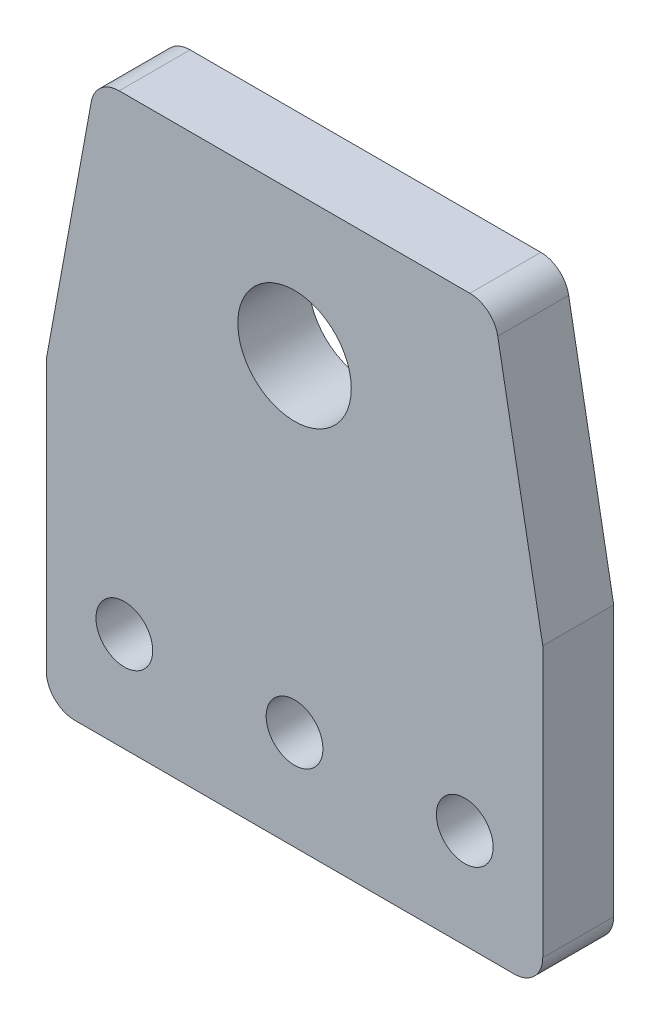
ISO-10303-21;
HEADER;
FILE_DESCRIPTION(('STEP AP214'),'2;1');
FILE_NAME('part.step','',(''),(''),'','','');
FILE_SCHEMA(('AUTOMOTIVE_DESIGN { 1 0 10303 214 1 1 1 1 }'));
ENDSEC;
DATA;
#1=APPLICATION_CONTEXT('core data for automotive mechanical design processes');
#2=APPLICATION_PROTOCOL_DEFINITION('international standard','automotive_design',2000,#1);
#3=PRODUCT_CONTEXT('',#1,'mechanical');
#4=PRODUCT('Part','Part','',(#3));
#5=PRODUCT_RELATED_PRODUCT_CATEGORY('part','',(#4));
#6=PRODUCT_DEFINITION_FORMATION('','',#4);
#7=PRODUCT_DEFINITION_CONTEXT('part definition',#1,'design');
#8=PRODUCT_DEFINITION('design','',#6,#7);
#9=PRODUCT_DEFINITION_SHAPE('','',#8);
#10=(LENGTH_UNIT() NAMED_UNIT(*) SI_UNIT(.MILLI.,.METRE.));
#11=(NAMED_UNIT(*) PLANE_ANGLE_UNIT() SI_UNIT($,.RADIAN.));
#12=(NAMED_UNIT(*) SI_UNIT($,.STERADIAN.) SOLID_ANGLE_UNIT());
#13=UNCERTAINTY_MEASURE_WITH_UNIT(LENGTH_MEASURE(1.E-05),#10,'distance_accuracy_value','');
#14=(GEOMETRIC_REPRESENTATION_CONTEXT(3) GLOBAL_UNCERTAINTY_ASSIGNED_CONTEXT((#13)) GLOBAL_UNIT_ASSIGNED_CONTEXT((#10,
#11,#12)) REPRESENTATION_CONTEXT('',''));
#15=CARTESIAN_POINT('',(0.,0.,0.));
#16=DIRECTION('',(0.,0.,1.));
#17=DIRECTION('',(1.,0.,0.));
#18=AXIS2_PLACEMENT_3D('',#15,#16,#17);
#19=CARTESIAN_POINT('',(33.,2.,5.));
#20=DIRECTION('',(0.,0.,1.));
#21=DIRECTION('',(1.,0.,0.));
#22=AXIS2_PLACEMENT_3D('',#19,#20,#21);
#23=PLANE('',#22);
#24=CARTESIAN_POINT('',(29.5,6.99999999999999,5.));
#25=DIRECTION('',(0.,0.,1.));
#26=DIRECTION('',(1.,0.,0.));
#27=AXIS2_PLACEMENT_3D('',#24,#25,#26);
#28=CIRCLE('',#27,2.00000000000001);
#29=CARTESIAN_POINT('',(31.5,6.99999999999999,5.));
#30=VERTEX_POINT('',#29);
#31=EDGE_CURVE('E221',#30,#30,#28,.T.);
#32=ORIENTED_EDGE('',*,*,#31,.F.);
#33=EDGE_LOOP('',(#32));
#34=FACE_BOUND('',#33,.T.);
#35=CARTESIAN_POINT('',(17.5,6.99999999999999,5.));
#36=DIRECTION('',(0.,0.,1.));
#37=DIRECTION('',(1.,0.,0.));
#38=AXIS2_PLACEMENT_3D('',#35,#36,#37);
#39=CIRCLE('',#38,2.);
#40=CARTESIAN_POINT('',(19.5,6.99999999999999,5.));
#41=VERTEX_POINT('',#40);
#42=EDGE_CURVE('E149',#41,#41,#39,.T.);
#43=ORIENTED_EDGE('',*,*,#42,.F.);
#44=EDGE_LOOP('',(#43));
#45=FACE_BOUND('',#44,.T.);
#46=CARTESIAN_POINT('',(33.,2.,5.));
#47=DIRECTION('',(0.,0.,1.));
#48=DIRECTION('',(1.,0.,0.));
#49=AXIS2_PLACEMENT_3D('',#46,#47,#48);
#50=CIRCLE('',#49,2.);
#51=CARTESIAN_POINT('',(33.,0.,5.));
#52=VERTEX_POINT('',#51);
#53=CARTESIAN_POINT('',(35.,2.,5.));
#54=VERTEX_POINT('',#53);
#55=EDGE_CURVE('E164',#52,#54,#50,.T.);
#56=ORIENTED_EDGE('',*,*,#55,.T.);
#57=DIRECTION('',(0.,1.,0.));
#58=VECTOR('',#57,1.);
#59=CARTESIAN_POINT('',(35.,2.,5.));
#60=LINE('',#59,#58);
#61=CARTESIAN_POINT('',(35.,21.0503418253546,5.));
#62=VERTEX_POINT('',#61);
#63=EDGE_CURVE('E102',#54,#62,#60,.T.);
#64=ORIENTED_EDGE('',*,*,#63,.T.);
#65=DIRECTION('',(-0.180238645749649,0.983622910763232,0.));
#66=VECTOR('',#65,1.);
#67=CARTESIAN_POINT('',(35.,21.0503418253546,5.));
#68=LINE('',#67,#66);
#69=CARTESIAN_POINT('',(31.828098105462,38.3604772914993,5.));
#70=VERTEX_POINT('',#69);
#71=EDGE_CURVE('E185',#62,#70,#68,.T.);
#72=ORIENTED_EDGE('',*,*,#71,.T.);
#73=CARTESIAN_POINT('',(29.8608522839355,38.,5.));
#74=DIRECTION('',(0.,0.,1.));
#75=DIRECTION('',(1.,0.,0.));
#76=AXIS2_PLACEMENT_3D('',#73,#74,#75);
#77=CIRCLE('',#76,1.99999999999999);
#78=CARTESIAN_POINT('',(29.8608522839355,40.,5.));
#79=VERTEX_POINT('',#78);
#80=EDGE_CURVE('E204',#70,#79,#77,.T.);
#81=ORIENTED_EDGE('',*,*,#80,.T.);
#82=DIRECTION('',(-1.,0.,0.));
#83=VECTOR('',#82,1.);
#84=CARTESIAN_POINT('',(29.8608522839355,40.,5.));
#85=LINE('',#84,#83);
#86=CARTESIAN_POINT('',(5.13914771606446,40.,5.));
#87=VERTEX_POINT('',#86);
#88=EDGE_CURVE('E201',#79,#87,#85,.T.);
#89=ORIENTED_EDGE('',*,*,#88,.T.);
#90=CARTESIAN_POINT('',(5.13914771606446,38.,5.));
#91=DIRECTION('',(0.,0.,1.));
#92=DIRECTION('',(1.,0.,0.));
#93=AXIS2_PLACEMENT_3D('',#90,#91,#92);
#94=CIRCLE('',#93,2.);
#95=CARTESIAN_POINT('',(3.171901894538,38.3604772914993,5.));
#96=VERTEX_POINT('',#95);
#97=EDGE_CURVE('E203',#87,#96,#94,.T.);
#98=ORIENTED_EDGE('',*,*,#97,.T.);
#99=DIRECTION('',(-0.180238645749649,-0.983622910763232,0.));
#100=VECTOR('',#99,1.);
#101=CARTESIAN_POINT('',(3.171901894538,38.3604772914993,5.));
#102=LINE('',#101,#100);
#103=CARTESIAN_POINT('',(0.,21.0503418253546,5.));
#104=VERTEX_POINT('',#103);
#105=EDGE_CURVE('E127',#96,#104,#102,.T.);
#106=ORIENTED_EDGE('',*,*,#105,.T.);
#107=DIRECTION('',(0.,-1.,0.));
#108=VECTOR('',#107,1.);
#109=CARTESIAN_POINT('',(0.,21.0503418253546,5.));
#110=LINE('',#109,#108);
#111=CARTESIAN_POINT('',(0.,2.,5.));
#112=VERTEX_POINT('',#111);
#113=EDGE_CURVE('E121',#104,#112,#110,.T.);
#114=ORIENTED_EDGE('',*,*,#113,.T.);
#115=CARTESIAN_POINT('',(2.,2.,5.));
#116=DIRECTION('',(0.,0.,1.));
#117=DIRECTION('',(-1.,0.,0.));
#118=AXIS2_PLACEMENT_3D('',#115,#116,#117);
#119=CIRCLE('',#118,2.);
#120=CARTESIAN_POINT('',(2.00000000000001,0.,5.));
#121=VERTEX_POINT('',#120);
#122=EDGE_CURVE('E125',#112,#121,#119,.T.);
#123=ORIENTED_EDGE('',*,*,#122,.T.);
#124=DIRECTION('',(1.,0.,0.));
#125=VECTOR('',#124,1.);
#126=CARTESIAN_POINT('',(2.00000000000001,0.,5.));
#127=LINE('',#126,#125);
#128=EDGE_CURVE('E53',#121,#52,#127,.T.);
#129=ORIENTED_EDGE('',*,*,#128,.T.);
#130=EDGE_LOOP('',(#56,#64,#72,#81,#89,#98,#106,#114,#123,#129));
#131=FACE_BOUND('',#130,.T.);
#132=CARTESIAN_POINT('',(17.5,30.,5.));
#133=DIRECTION('',(0.,0.,1.));
#134=DIRECTION('',(1.,0.,0.));
#135=AXIS2_PLACEMENT_3D('',#132,#133,#134);
#136=CIRCLE('',#135,4.);
#137=CARTESIAN_POINT('',(21.5,30.,5.));
#138=VERTEX_POINT('',#137);
#139=EDGE_CURVE('E215',#138,#138,#136,.T.);
#140=ORIENTED_EDGE('',*,*,#139,.F.);
#141=EDGE_LOOP('',(#140));
#142=FACE_BOUND('',#141,.T.);
#143=CARTESIAN_POINT('',(5.5,6.99999999999999,5.));
#144=DIRECTION('',(0.,0.,1.));
#145=DIRECTION('',(1.,0.,0.));
#146=AXIS2_PLACEMENT_3D('',#143,#144,#145);
#147=CIRCLE('',#146,2.);
#148=CARTESIAN_POINT('',(7.5,6.99999999999999,5.));
#149=VERTEX_POINT('',#148);
#150=EDGE_CURVE('E227',#149,#149,#147,.T.);
#151=ORIENTED_EDGE('',*,*,#150,.F.);
#152=EDGE_LOOP('',(#151));
#153=FACE_BOUND('',#152,.T.);
#154=ADVANCED_FACE('F36',(#34,#45,#131,#142,#153),#23,.T.);
#155=CARTESIAN_POINT('',(33.,2.,0.));
#156=DIRECTION('',(0.,0.,1.));
#157=DIRECTION('',(1.,0.,0.));
#158=AXIS2_PLACEMENT_3D('',#155,#156,#157);
#159=PLANE('',#158);
#160=CARTESIAN_POINT('',(33.,2.,0.));
#161=DIRECTION('',(0.,0.,1.));
#162=DIRECTION('',(1.,0.,0.));
#163=AXIS2_PLACEMENT_3D('',#160,#161,#162);
#164=CIRCLE('',#163,2.);
#165=CARTESIAN_POINT('',(33.,0.,0.));
#166=VERTEX_POINT('',#165);
#167=CARTESIAN_POINT('',(35.,2.,0.));
#168=VERTEX_POINT('',#167);
#169=EDGE_CURVE('E145',#166,#168,#164,.T.);
#170=ORIENTED_EDGE('',*,*,#169,.F.);
#171=DIRECTION('',(1.,0.,0.));
#172=VECTOR('',#171,1.);
#173=CARTESIAN_POINT('',(2.00000000000001,0.,0.));
#174=LINE('',#173,#172);
#175=CARTESIAN_POINT('',(2.00000000000001,0.,0.));
#176=VERTEX_POINT('',#175);
#177=EDGE_CURVE('E94',#176,#166,#174,.T.);
#178=ORIENTED_EDGE('',*,*,#177,.F.);
#179=CARTESIAN_POINT('',(2.,2.,0.));
#180=DIRECTION('',(0.,0.,1.));
#181=DIRECTION('',(-1.,0.,0.));
#182=AXIS2_PLACEMENT_3D('',#179,#180,#181);
#183=CIRCLE('',#182,2.);
#184=CARTESIAN_POINT('',(0.,2.,0.));
#185=VERTEX_POINT('',#184);
#186=EDGE_CURVE('E88',#185,#176,#183,.T.);
#187=ORIENTED_EDGE('',*,*,#186,.F.);
#188=DIRECTION('',(0.,-1.,0.));
#189=VECTOR('',#188,1.);
#190=CARTESIAN_POINT('',(0.,21.0503418253546,0.));
#191=LINE('',#190,#189);
#192=CARTESIAN_POINT('',(0.,21.0503418253546,0.));
#193=VERTEX_POINT('',#192);
#194=EDGE_CURVE('E135',#193,#185,#191,.T.);
#195=ORIENTED_EDGE('',*,*,#194,.F.);
#196=DIRECTION('',(-0.180238645749649,-0.983622910763232,0.));
#197=VECTOR('',#196,1.);
#198=CARTESIAN_POINT('',(3.171901894538,38.3604772914993,0.));
#199=LINE('',#198,#197);
#200=CARTESIAN_POINT('',(3.171901894538,38.3604772914993,0.));
#201=VERTEX_POINT('',#200);
#202=EDGE_CURVE('E159',#201,#193,#199,.T.);
#203=ORIENTED_EDGE('',*,*,#202,.F.);
#204=CARTESIAN_POINT('',(5.13914771606446,38.,0.));
#205=DIRECTION('',(0.,0.,1.));
#206=DIRECTION('',(1.,0.,0.));
#207=AXIS2_PLACEMENT_3D('',#204,#205,#206);
#208=CIRCLE('',#207,2.);
#209=CARTESIAN_POINT('',(5.13914771606446,40.,0.));
#210=VERTEX_POINT('',#209);
#211=EDGE_CURVE('E157',#210,#201,#208,.T.);
#212=ORIENTED_EDGE('',*,*,#211,.F.);
#213=DIRECTION('',(-1.,0.,0.));
#214=VECTOR('',#213,1.);
#215=CARTESIAN_POINT('',(29.8608522839355,40.,0.));
#216=LINE('',#215,#214);
#217=CARTESIAN_POINT('',(29.8608522839355,40.,0.));
#218=VERTEX_POINT('',#217);
#219=EDGE_CURVE('E155',#218,#210,#216,.T.);
#220=ORIENTED_EDGE('',*,*,#219,.F.);
#221=CARTESIAN_POINT('',(29.8608522839355,38.,0.));
#222=DIRECTION('',(0.,0.,1.));
#223=DIRECTION('',(1.,0.,0.));
#224=AXIS2_PLACEMENT_3D('',#221,#222,#223);
#225=CIRCLE('',#224,1.99999999999999);
#226=CARTESIAN_POINT('',(31.828098105462,38.3604772914993,0.));
#227=VERTEX_POINT('',#226);
#228=EDGE_CURVE('E153',#227,#218,#225,.T.);
#229=ORIENTED_EDGE('',*,*,#228,.F.);
#230=DIRECTION('',(-0.180238645749649,0.983622910763232,0.));
#231=VECTOR('',#230,1.);
#232=CARTESIAN_POINT('',(35.,21.0503418253546,0.));
#233=LINE('',#232,#231);
#234=CARTESIAN_POINT('',(35.,21.0503418253546,0.));
#235=VERTEX_POINT('',#234);
#236=EDGE_CURVE('E151',#235,#227,#233,.T.);
#237=ORIENTED_EDGE('',*,*,#236,.F.);
#238=DIRECTION('',(0.,1.,0.));
#239=VECTOR('',#238,1.);
#240=CARTESIAN_POINT('',(35.,2.,0.));
#241=LINE('',#240,#239);
#242=EDGE_CURVE('E148',#168,#235,#241,.T.);
#243=ORIENTED_EDGE('',*,*,#242,.F.);
#244=EDGE_LOOP('',(#170,#178,#187,#195,#203,#212,#220,#229,#237,#243));
#245=FACE_BOUND('',#244,.T.);
#246=CARTESIAN_POINT('',(17.5,6.99999999999999,0.));
#247=DIRECTION('',(0.,0.,1.));
#248=DIRECTION('',(1.,0.,0.));
#249=AXIS2_PLACEMENT_3D('',#246,#247,#248);
#250=CIRCLE('',#249,2.);
#251=CARTESIAN_POINT('',(19.5,6.99999999999999,0.));
#252=VERTEX_POINT('',#251);
#253=EDGE_CURVE('E212',#252,#252,#250,.T.);
#254=ORIENTED_EDGE('',*,*,#253,.T.);
#255=EDGE_LOOP('',(#254));
#256=FACE_BOUND('',#255,.T.);
#257=CARTESIAN_POINT('',(17.5,30.,0.));
#258=DIRECTION('',(0.,0.,1.));
#259=DIRECTION('',(1.,0.,0.));
#260=AXIS2_PLACEMENT_3D('',#257,#258,#259);
#261=CIRCLE('',#260,4.);
#262=CARTESIAN_POINT('',(21.5,30.,0.));
#263=VERTEX_POINT('',#262);
#264=EDGE_CURVE('E218',#263,#263,#261,.T.);
#265=ORIENTED_EDGE('',*,*,#264,.T.);
#266=EDGE_LOOP('',(#265));
#267=FACE_BOUND('',#266,.T.);
#268=CARTESIAN_POINT('',(29.5,6.99999999999999,0.));
#269=DIRECTION('',(0.,0.,1.));
#270=DIRECTION('',(1.,0.,0.));
#271=AXIS2_PLACEMENT_3D('',#268,#269,#270);
#272=CIRCLE('',#271,2.00000000000001);
#273=CARTESIAN_POINT('',(31.5,6.99999999999999,0.));
#274=VERTEX_POINT('',#273);
#275=EDGE_CURVE('E224',#274,#274,#272,.T.);
#276=ORIENTED_EDGE('',*,*,#275,.T.);
#277=EDGE_LOOP('',(#276));
#278=FACE_BOUND('',#277,.T.);
#279=CARTESIAN_POINT('',(5.5,6.99999999999999,0.));
#280=DIRECTION('',(0.,0.,1.));
#281=DIRECTION('',(1.,0.,0.));
#282=AXIS2_PLACEMENT_3D('',#279,#280,#281);
#283=CIRCLE('',#282,2.);
#284=CARTESIAN_POINT('',(7.5,6.99999999999999,0.));
#285=VERTEX_POINT('',#284);
#286=EDGE_CURVE('E230',#285,#285,#283,.T.);
#287=ORIENTED_EDGE('',*,*,#286,.T.);
#288=EDGE_LOOP('',(#287));
#289=FACE_BOUND('',#288,.T.);
#290=ADVANCED_FACE('F189',(#245,#256,#267,#278,#289),#159,.F.);
#291=CARTESIAN_POINT('',(33.,2.,5.));
#292=DIRECTION('',(0.,0.,-1.));
#293=DIRECTION('',(-1.,0.,0.));
#294=AXIS2_PLACEMENT_3D('',#291,#292,#293);
#295=CYLINDRICAL_SURFACE('',#294,2.);
#296=ORIENTED_EDGE('',*,*,#169,.T.);
#297=DIRECTION('',(0.,0.,-1.));
#298=VECTOR('',#297,1.);
#299=CARTESIAN_POINT('',(35.,2.,5.));
#300=LINE('',#299,#298);
#301=EDGE_CURVE('E11',#54,#168,#300,.T.);
#302=ORIENTED_EDGE('',*,*,#301,.F.);
#303=ORIENTED_EDGE('',*,*,#55,.F.);
#304=DIRECTION('',(0.,0.,-1.));
#305=VECTOR('',#304,1.);
#306=CARTESIAN_POINT('',(33.,0.,5.));
#307=LINE('',#306,#305);
#308=EDGE_CURVE('E141',#52,#166,#307,.T.);
#309=ORIENTED_EDGE('',*,*,#308,.T.);
#310=EDGE_LOOP('',(#296,#302,#303,#309));
#311=FACE_BOUND('',#310,.T.);
#312=ADVANCED_FACE('F38',(#311),#295,.T.);
#313=CARTESIAN_POINT('',(35.,2.,5.));
#314=DIRECTION('',(-1.,0.,0.));
#315=DIRECTION('',(0.,-1.,0.));
#316=AXIS2_PLACEMENT_3D('',#313,#314,#315);
#317=PLANE('',#316);
#318=ORIENTED_EDGE('',*,*,#242,.T.);
#319=DIRECTION('',(0.,0.,-1.));
#320=VECTOR('',#319,1.);
#321=CARTESIAN_POINT('',(35.,21.0503418253546,5.));
#322=LINE('',#321,#320);
#323=EDGE_CURVE('E45',#62,#235,#322,.T.);
#324=ORIENTED_EDGE('',*,*,#323,.F.);
#325=ORIENTED_EDGE('',*,*,#63,.F.);
#326=ORIENTED_EDGE('',*,*,#301,.T.);
#327=EDGE_LOOP('',(#318,#324,#325,#326));
#328=FACE_BOUND('',#327,.T.);
#329=ADVANCED_FACE('F272',(#328),#317,.F.);
#330=CARTESIAN_POINT('',(35.,21.0503418253546,5.));
#331=DIRECTION('',(-0.983622910763232,-0.180238645749649,0.));
#332=DIRECTION('',(0.180238645749649,-0.983622910763232,0.));
#333=AXIS2_PLACEMENT_3D('',#330,#331,#332);
#334=PLANE('',#333);
#335=ORIENTED_EDGE('',*,*,#236,.T.);
#336=DIRECTION('',(0.,0.,-1.));
#337=VECTOR('',#336,1.);
#338=CARTESIAN_POINT('',(31.828098105462,38.3604772914993,5.));
#339=LINE('',#338,#337);
#340=EDGE_CURVE('E177',#70,#227,#339,.T.);
#341=ORIENTED_EDGE('',*,*,#340,.F.);
#342=ORIENTED_EDGE('',*,*,#71,.F.);
#343=ORIENTED_EDGE('',*,*,#323,.T.);
#344=EDGE_LOOP('',(#335,#341,#342,#343));
#345=FACE_BOUND('',#344,.T.);
#346=ADVANCED_FACE('F183',(#345),#334,.F.);
#347=CARTESIAN_POINT('',(29.8608522839355,38.,5.));
#348=DIRECTION('',(0.,0.,-1.));
#349=DIRECTION('',(-1.,0.,0.));
#350=AXIS2_PLACEMENT_3D('',#347,#348,#349);
#351=CYLINDRICAL_SURFACE('',#350,1.99999999999999);
#352=ORIENTED_EDGE('',*,*,#228,.T.);
#353=DIRECTION('',(0.,0.,-1.));
#354=VECTOR('',#353,1.);
#355=CARTESIAN_POINT('',(29.8608522839355,40.,5.));
#356=LINE('',#355,#354);
#357=EDGE_CURVE('E174',#79,#218,#356,.T.);
#358=ORIENTED_EDGE('',*,*,#357,.F.);
#359=ORIENTED_EDGE('',*,*,#80,.F.);
#360=ORIENTED_EDGE('',*,*,#340,.T.);
#361=EDGE_LOOP('',(#352,#358,#359,#360));
#362=FACE_BOUND('',#361,.T.);
#363=ADVANCED_FACE('F195',(#362),#351,.T.);
#364=CARTESIAN_POINT('',(29.8608522839355,40.,5.));
#365=DIRECTION('',(0.,-1.,0.));
#366=DIRECTION('',(1.,0.,0.));
#367=AXIS2_PLACEMENT_3D('',#364,#365,#366);
#368=PLANE('',#367);
#369=ORIENTED_EDGE('',*,*,#219,.T.);
#370=DIRECTION('',(0.,0.,-1.));
#371=VECTOR('',#370,1.);
#372=CARTESIAN_POINT('',(5.13914771606446,40.,5.));
#373=LINE('',#372,#371);
#374=EDGE_CURVE('E171',#87,#210,#373,.T.);
#375=ORIENTED_EDGE('',*,*,#374,.F.);
#376=ORIENTED_EDGE('',*,*,#88,.F.);
#377=ORIENTED_EDGE('',*,*,#357,.T.);
#378=EDGE_LOOP('',(#369,#375,#376,#377));
#379=FACE_BOUND('',#378,.T.);
#380=ADVANCED_FACE('F199',(#379),#368,.F.);
#381=CARTESIAN_POINT('',(5.13914771606446,38.,5.));
#382=DIRECTION('',(0.,0.,-1.));
#383=DIRECTION('',(-1.,0.,0.));
#384=AXIS2_PLACEMENT_3D('',#381,#382,#383);
#385=CYLINDRICAL_SURFACE('',#384,2.);
#386=ORIENTED_EDGE('',*,*,#211,.T.);
#387=DIRECTION('',(0.,0.,-1.));
#388=VECTOR('',#387,1.);
#389=CARTESIAN_POINT('',(3.171901894538,38.3604772914993,5.));
#390=LINE('',#389,#388);
#391=EDGE_CURVE('E168',#96,#201,#390,.T.);
#392=ORIENTED_EDGE('',*,*,#391,.F.);
#393=ORIENTED_EDGE('',*,*,#97,.F.);
#394=ORIENTED_EDGE('',*,*,#374,.T.);
#395=EDGE_LOOP('',(#386,#392,#393,#394));
#396=FACE_BOUND('',#395,.T.);
#397=ADVANCED_FACE('F262',(#396),#385,.T.);
#398=CARTESIAN_POINT('',(3.171901894538,38.3604772914993,5.));
#399=DIRECTION('',(0.983622910763232,-0.180238645749649,0.));
#400=DIRECTION('',(0.180238645749649,0.983622910763232,0.));
#401=AXIS2_PLACEMENT_3D('',#398,#399,#400);
#402=PLANE('',#401);
#403=ORIENTED_EDGE('',*,*,#202,.T.);
#404=DIRECTION('',(0.,0.,-1.));
#405=VECTOR('',#404,1.);
#406=CARTESIAN_POINT('',(0.,21.0503418253546,5.));
#407=LINE('',#406,#405);
#408=EDGE_CURVE('E136',#104,#193,#407,.T.);
#409=ORIENTED_EDGE('',*,*,#408,.F.);
#410=ORIENTED_EDGE('',*,*,#105,.F.);
#411=ORIENTED_EDGE('',*,*,#391,.T.);
#412=EDGE_LOOP('',(#403,#409,#410,#411));
#413=FACE_BOUND('',#412,.T.);
#414=ADVANCED_FACE('F259',(#413),#402,.F.);
#415=CARTESIAN_POINT('',(0.,21.0503418253546,5.));
#416=DIRECTION('',(1.,0.,0.));
#417=DIRECTION('',(0.,1.,0.));
#418=AXIS2_PLACEMENT_3D('',#415,#416,#417);
#419=PLANE('',#418);
#420=ORIENTED_EDGE('',*,*,#194,.T.);
#421=DIRECTION('',(0.,0.,-1.));
#422=VECTOR('',#421,1.);
#423=CARTESIAN_POINT('',(0.,2.,5.));
#424=LINE('',#423,#422);
#425=EDGE_CURVE('E132',#112,#185,#424,.T.);
#426=ORIENTED_EDGE('',*,*,#425,.F.);
#427=ORIENTED_EDGE('',*,*,#113,.F.);
#428=ORIENTED_EDGE('',*,*,#408,.T.);
#429=EDGE_LOOP('',(#420,#426,#427,#428));
#430=FACE_BOUND('',#429,.T.);
#431=ADVANCED_FACE('F133',(#430),#419,.F.);
#432=CARTESIAN_POINT('',(2.,2.,5.));
#433=DIRECTION('',(0.,0.,-1.));
#434=DIRECTION('',(-1.,0.,0.));
#435=AXIS2_PLACEMENT_3D('',#432,#433,#434);
#436=CYLINDRICAL_SURFACE('',#435,2.);
#437=ORIENTED_EDGE('',*,*,#186,.T.);
#438=DIRECTION('',(0.,0.,-1.));
#439=VECTOR('',#438,1.);
#440=CARTESIAN_POINT('',(2.00000000000001,0.,5.));
#441=LINE('',#440,#439);
#442=EDGE_CURVE('E137',#121,#176,#441,.T.);
#443=ORIENTED_EDGE('',*,*,#442,.F.);
#444=ORIENTED_EDGE('',*,*,#122,.F.);
#445=ORIENTED_EDGE('',*,*,#425,.T.);
#446=EDGE_LOOP('',(#437,#443,#444,#445));
#447=FACE_BOUND('',#446,.T.);
#448=ADVANCED_FACE('F139',(#447),#436,.T.);
#449=CARTESIAN_POINT('',(2.00000000000001,0.,5.));
#450=DIRECTION('',(0.,1.,0.));
#451=DIRECTION('',(0.,0.,1.));
#452=AXIS2_PLACEMENT_3D('',#449,#450,#451);
#453=PLANE('',#452);
#454=ORIENTED_EDGE('',*,*,#177,.T.);
#455=ORIENTED_EDGE('',*,*,#308,.F.);
#456=ORIENTED_EDGE('',*,*,#128,.F.);
#457=ORIENTED_EDGE('',*,*,#442,.T.);
#458=EDGE_LOOP('',(#454,#455,#456,#457));
#459=FACE_BOUND('',#458,.T.);
#460=ADVANCED_FACE('F252',(#459),#453,.F.);
#461=CARTESIAN_POINT('',(17.5,6.99999999999999,5.));
#462=DIRECTION('',(0.,0.,-1.));
#463=DIRECTION('',(-1.,0.,0.));
#464=AXIS2_PLACEMENT_3D('',#461,#462,#463);
#465=CYLINDRICAL_SURFACE('',#464,2.);
#466=ORIENTED_EDGE('',*,*,#42,.T.);
#467=EDGE_LOOP('',(#466));
#468=FACE_BOUND('',#467,.T.);
#469=ORIENTED_EDGE('',*,*,#253,.F.);
#470=EDGE_LOOP('',(#469));
#471=FACE_BOUND('',#470,.T.);
#472=ADVANCED_FACE('F249',(#468,#471),#465,.F.);
#473=CARTESIAN_POINT('',(17.5,30.,5.));
#474=DIRECTION('',(0.,0.,-1.));
#475=DIRECTION('',(-1.,0.,0.));
#476=AXIS2_PLACEMENT_3D('',#473,#474,#475);
#477=CYLINDRICAL_SURFACE('',#476,4.);
#478=ORIENTED_EDGE('',*,*,#139,.T.);
#479=EDGE_LOOP('',(#478));
#480=FACE_BOUND('',#479,.T.);
#481=ORIENTED_EDGE('',*,*,#264,.F.);
#482=EDGE_LOOP('',(#481));
#483=FACE_BOUND('',#482,.T.);
#484=ADVANCED_FACE('F348',(#480,#483),#477,.F.);
#485=CARTESIAN_POINT('',(29.5,6.99999999999999,5.));
#486=DIRECTION('',(0.,0.,-1.));
#487=DIRECTION('',(-1.,0.,0.));
#488=AXIS2_PLACEMENT_3D('',#485,#486,#487);
#489=CYLINDRICAL_SURFACE('',#488,2.00000000000001);
#490=ORIENTED_EDGE('',*,*,#31,.T.);
#491=EDGE_LOOP('',(#490));
#492=FACE_BOUND('',#491,.T.);
#493=ORIENTED_EDGE('',*,*,#275,.F.);
#494=EDGE_LOOP('',(#493));
#495=FACE_BOUND('',#494,.T.);
#496=ADVANCED_FACE('F356',(#492,#495),#489,.F.);
#497=CARTESIAN_POINT('',(5.5,6.99999999999999,5.));
#498=DIRECTION('',(0.,0.,-1.));
#499=DIRECTION('',(-1.,0.,0.));
#500=AXIS2_PLACEMENT_3D('',#497,#498,#499);
#501=CYLINDRICAL_SURFACE('',#500,2.);
#502=ORIENTED_EDGE('',*,*,#150,.T.);
#503=EDGE_LOOP('',(#502));
#504=FACE_BOUND('',#503,.T.);
#505=ORIENTED_EDGE('',*,*,#286,.F.);
#506=EDGE_LOOP('',(#505));
#507=FACE_BOUND('',#506,.T.);
#508=ADVANCED_FACE('F236',(#504,#507),#501,.F.);
#509=CLOSED_SHELL('',(#154,#290,#312,#329,#346,#363,#380,#397,#414,#431,#448,#460,#472,#484,
#496,#508));
#510=MANIFOLD_SOLID_BREP('B2',#509);
#511=ADVANCED_BREP_SHAPE_REPRESENTATION('',(#18,#510),#14);
#512=SHAPE_DEFINITION_REPRESENTATION(#9,#511);
ENDSEC;
END-ISO-10303-21;
